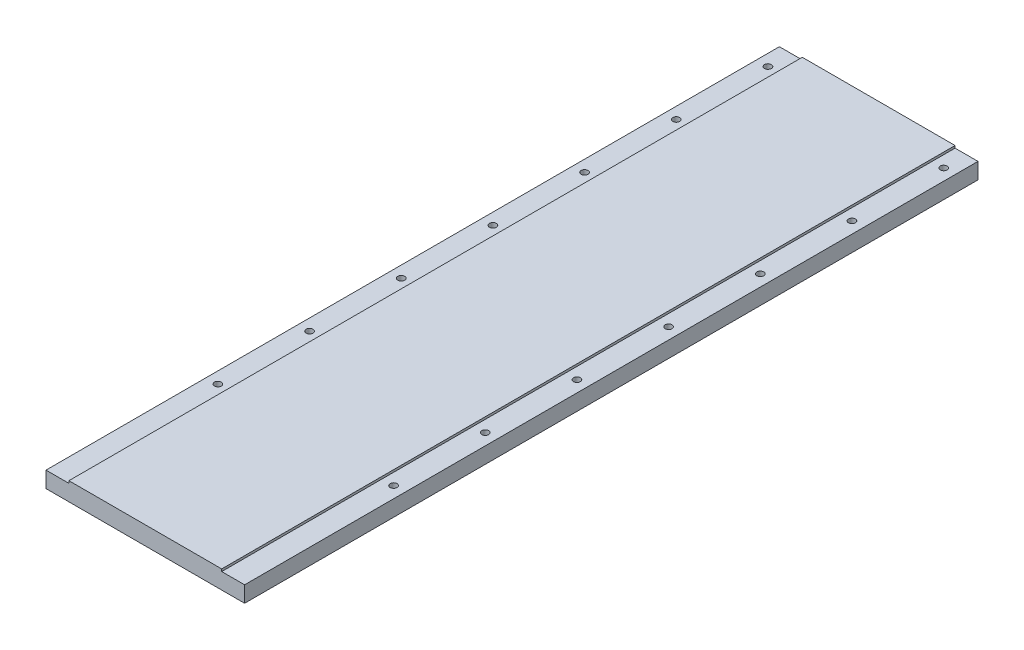
ISO-10303-21;
HEADER;
FILE_DESCRIPTION(('STEP AP214'),'2;1');
FILE_NAME('part.step','',(''),(''),'','','');
FILE_SCHEMA(('AUTOMOTIVE_DESIGN { 1 0 10303 214 1 1 1 1 }'));
ENDSEC;
DATA;
#1=APPLICATION_CONTEXT('core data for automotive mechanical design processes');
#2=APPLICATION_PROTOCOL_DEFINITION('international standard','automotive_design',2000,#1);
#3=PRODUCT_CONTEXT('',#1,'mechanical');
#4=PRODUCT('Part','Part','',(#3));
#5=PRODUCT_RELATED_PRODUCT_CATEGORY('part','',(#4));
#6=PRODUCT_DEFINITION_FORMATION('','',#4);
#7=PRODUCT_DEFINITION_CONTEXT('part definition',#1,'design');
#8=PRODUCT_DEFINITION('design','',#6,#7);
#9=PRODUCT_DEFINITION_SHAPE('','',#8);
#10=(LENGTH_UNIT() NAMED_UNIT(*) SI_UNIT(.MILLI.,.METRE.));
#11=(NAMED_UNIT(*) PLANE_ANGLE_UNIT() SI_UNIT($,.RADIAN.));
#12=(NAMED_UNIT(*) SI_UNIT($,.STERADIAN.) SOLID_ANGLE_UNIT());
#13=UNCERTAINTY_MEASURE_WITH_UNIT(LENGTH_MEASURE(1.E-05),#10,'distance_accuracy_value','');
#14=(GEOMETRIC_REPRESENTATION_CONTEXT(3) GLOBAL_UNCERTAINTY_ASSIGNED_CONTEXT((#13)) GLOBAL_UNIT_ASSIGNED_CONTEXT((#10,
#11,#12)) REPRESENTATION_CONTEXT('',''));
#15=CARTESIAN_POINT('',(0.,0.,0.));
#16=DIRECTION('',(0.,0.,1.));
#17=DIRECTION('',(1.,0.,0.));
#18=AXIS2_PLACEMENT_3D('',#15,#16,#17);
#19=CARTESIAN_POINT('',(-50.,10.5,480.));
#20=DIRECTION('',(0.,-1.,0.));
#21=DIRECTION('',(1.,0.,0.));
#22=AXIS2_PLACEMENT_3D('',#19,#20,#21);
#23=PLANE('',#22);
#24=CARTESIAN_POINT('',(-57.5,10.5,375.));
#25=DIRECTION('',(0.,1.,0.));
#26=DIRECTION('',(0.,0.,1.));
#27=AXIS2_PLACEMENT_3D('',#24,#25,#26);
#28=CIRCLE('',#27,2.24999999999999);
#29=CARTESIAN_POINT('',(-57.5,10.5,377.25));
#30=VERTEX_POINT('',#29);
#31=EDGE_CURVE('E221',#30,#30,#28,.T.);
#32=ORIENTED_EDGE('',*,*,#31,.F.);
#33=EDGE_LOOP('',(#32));
#34=FACE_BOUND('',#33,.T.);
#35=CARTESIAN_POINT('',(-57.5,10.5,315.));
#36=DIRECTION('',(0.,1.,0.));
#37=DIRECTION('',(0.,0.,1.));
#38=AXIS2_PLACEMENT_3D('',#35,#36,#37);
#39=CIRCLE('',#38,2.24999999999999);
#40=CARTESIAN_POINT('',(-57.5,10.5,317.25));
#41=VERTEX_POINT('',#40);
#42=EDGE_CURVE('E215',#41,#41,#39,.T.);
#43=ORIENTED_EDGE('',*,*,#42,.F.);
#44=EDGE_LOOP('',(#43));
#45=FACE_BOUND('',#44,.T.);
#46=CARTESIAN_POINT('',(-57.5,10.5,255.));
#47=DIRECTION('',(0.,1.,0.));
#48=DIRECTION('',(0.,0.,1.));
#49=AXIS2_PLACEMENT_3D('',#46,#47,#48);
#50=CIRCLE('',#49,2.24999999999999);
#51=CARTESIAN_POINT('',(-57.5,10.5,257.25));
#52=VERTEX_POINT('',#51);
#53=EDGE_CURVE('E209',#52,#52,#50,.T.);
#54=ORIENTED_EDGE('',*,*,#53,.F.);
#55=EDGE_LOOP('',(#54));
#56=FACE_BOUND('',#55,.T.);
#57=CARTESIAN_POINT('',(-57.5,10.5,195.));
#58=DIRECTION('',(0.,1.,0.));
#59=DIRECTION('',(0.,0.,1.));
#60=AXIS2_PLACEMENT_3D('',#57,#58,#59);
#61=CIRCLE('',#60,2.24999999999999);
#62=CARTESIAN_POINT('',(-57.5,10.5,197.25));
#63=VERTEX_POINT('',#62);
#64=EDGE_CURVE('E203',#63,#63,#61,.T.);
#65=ORIENTED_EDGE('',*,*,#64,.F.);
#66=EDGE_LOOP('',(#65));
#67=FACE_BOUND('',#66,.T.);
#68=CARTESIAN_POINT('',(-57.5,10.5,135.));
#69=DIRECTION('',(0.,1.,0.));
#70=DIRECTION('',(0.,0.,1.));
#71=AXIS2_PLACEMENT_3D('',#68,#69,#70);
#72=CIRCLE('',#71,2.24999999999999);
#73=CARTESIAN_POINT('',(-57.5,10.5,137.25));
#74=VERTEX_POINT('',#73);
#75=EDGE_CURVE('E197',#74,#74,#72,.T.);
#76=ORIENTED_EDGE('',*,*,#75,.F.);
#77=EDGE_LOOP('',(#76));
#78=FACE_BOUND('',#77,.T.);
#79=CARTESIAN_POINT('',(-57.5,10.5,75.));
#80=DIRECTION('',(0.,1.,0.));
#81=DIRECTION('',(0.,0.,1.));
#82=AXIS2_PLACEMENT_3D('',#79,#80,#81);
#83=CIRCLE('',#82,2.24999999999999);
#84=CARTESIAN_POINT('',(-57.5,10.5,77.25));
#85=VERTEX_POINT('',#84);
#86=EDGE_CURVE('E191',#85,#85,#83,.T.);
#87=ORIENTED_EDGE('',*,*,#86,.F.);
#88=EDGE_LOOP('',(#87));
#89=FACE_BOUND('',#88,.T.);
#90=CARTESIAN_POINT('',(-57.5,10.5,15.));
#91=DIRECTION('',(0.,1.,0.));
#92=DIRECTION('',(0.,0.,1.));
#93=AXIS2_PLACEMENT_3D('',#90,#91,#92);
#94=CIRCLE('',#93,2.24999999999999);
#95=CARTESIAN_POINT('',(-57.5,10.5,17.25));
#96=VERTEX_POINT('',#95);
#97=EDGE_CURVE('E185',#96,#96,#94,.T.);
#98=ORIENTED_EDGE('',*,*,#97,.F.);
#99=EDGE_LOOP('',(#98));
#100=FACE_BOUND('',#99,.T.);
#101=DIRECTION('',(-1.,0.,0.));
#102=VECTOR('',#101,1.);
#103=CARTESIAN_POINT('',(-50.,10.5,0.));
#104=LINE('',#103,#102);
#105=CARTESIAN_POINT('',(-50.,10.5,0.));
#106=VERTEX_POINT('',#105);
#107=CARTESIAN_POINT('',(-65.,10.5,0.));
#108=VERTEX_POINT('',#107);
#109=EDGE_CURVE('E135',#106,#108,#104,.T.);
#110=ORIENTED_EDGE('',*,*,#109,.T.);
#111=DIRECTION('',(0.,0.,-1.));
#112=VECTOR('',#111,1.);
#113=CARTESIAN_POINT('',(-65.,10.5,480.));
#114=LINE('',#113,#112);
#115=CARTESIAN_POINT('',(-65.,10.5,480.));
#116=VERTEX_POINT('',#115);
#117=EDGE_CURVE('E11',#116,#108,#114,.T.);
#118=ORIENTED_EDGE('',*,*,#117,.F.);
#119=DIRECTION('',(-1.,0.,0.));
#120=VECTOR('',#119,1.);
#121=CARTESIAN_POINT('',(-50.,10.5,480.));
#122=LINE('',#121,#120);
#123=CARTESIAN_POINT('',(-50.,10.5,480.));
#124=VERTEX_POINT('',#123);
#125=EDGE_CURVE('E150',#124,#116,#122,.T.);
#126=ORIENTED_EDGE('',*,*,#125,.F.);
#127=DIRECTION('',(0.,0.,-1.));
#128=VECTOR('',#127,1.);
#129=CARTESIAN_POINT('',(-50.,10.5,480.));
#130=LINE('',#129,#128);
#131=EDGE_CURVE('E131',#124,#106,#130,.T.);
#132=ORIENTED_EDGE('',*,*,#131,.T.);
#133=EDGE_LOOP('',(#110,#118,#126,#132));
#134=FACE_BOUND('',#133,.T.);
#135=ADVANCED_FACE('F39',(#34,#45,#56,#67,#78,#89,#100,#134),#23,.F.);
#136=CARTESIAN_POINT('',(-65.,10.5,480.));
#137=DIRECTION('',(1.,0.,0.));
#138=DIRECTION('',(0.,0.,-1.));
#139=AXIS2_PLACEMENT_3D('',#136,#137,#138);
#140=PLANE('',#139);
#141=DIRECTION('',(0.,-1.,0.));
#142=VECTOR('',#141,1.);
#143=CARTESIAN_POINT('',(-65.,10.5,0.));
#144=LINE('',#143,#142);
#145=CARTESIAN_POINT('',(-65.,0.,0.));
#146=VERTEX_POINT('',#145);
#147=EDGE_CURVE('E138',#108,#146,#144,.T.);
#148=ORIENTED_EDGE('',*,*,#147,.T.);
#149=DIRECTION('',(0.,0.,-1.));
#150=VECTOR('',#149,1.);
#151=CARTESIAN_POINT('',(-65.,0.,480.));
#152=LINE('',#151,#150);
#153=CARTESIAN_POINT('',(-65.,0.,480.));
#154=VERTEX_POINT('',#153);
#155=EDGE_CURVE('E47',#154,#146,#152,.T.);
#156=ORIENTED_EDGE('',*,*,#155,.F.);
#157=DIRECTION('',(0.,-1.,0.));
#158=VECTOR('',#157,1.);
#159=CARTESIAN_POINT('',(-65.,10.5,480.));
#160=LINE('',#159,#158);
#161=EDGE_CURVE('E98',#116,#154,#160,.T.);
#162=ORIENTED_EDGE('',*,*,#161,.F.);
#163=ORIENTED_EDGE('',*,*,#117,.T.);
#164=EDGE_LOOP('',(#148,#156,#162,#163));
#165=FACE_BOUND('',#164,.T.);
#166=ADVANCED_FACE('F302',(#165),#140,.F.);
#167=CARTESIAN_POINT('',(-65.,0.,480.));
#168=DIRECTION('',(0.,1.,0.));
#169=DIRECTION('',(0.,0.,1.));
#170=AXIS2_PLACEMENT_3D('',#167,#168,#169);
#171=PLANE('',#170);
#172=CARTESIAN_POINT('',(57.5,0.,375.));
#173=DIRECTION('',(0.,1.,0.));
#174=DIRECTION('',(0.,0.,1.));
#175=AXIS2_PLACEMENT_3D('',#172,#173,#174);
#176=CIRCLE('',#175,2.24999999999999);
#177=CARTESIAN_POINT('',(57.5,0.,377.25));
#178=VERTEX_POINT('',#177);
#179=EDGE_CURVE('E260',#178,#178,#176,.T.);
#180=ORIENTED_EDGE('',*,*,#179,.T.);
#181=EDGE_LOOP('',(#180));
#182=FACE_BOUND('',#181,.T.);
#183=CARTESIAN_POINT('',(57.5,0.,315.));
#184=DIRECTION('',(0.,1.,0.));
#185=DIRECTION('',(0.,0.,1.));
#186=AXIS2_PLACEMENT_3D('',#183,#184,#185);
#187=CIRCLE('',#186,2.24999999999999);
#188=CARTESIAN_POINT('',(57.5,0.,317.25));
#189=VERTEX_POINT('',#188);
#190=EDGE_CURVE('E254',#189,#189,#187,.T.);
#191=ORIENTED_EDGE('',*,*,#190,.T.);
#192=EDGE_LOOP('',(#191));
#193=FACE_BOUND('',#192,.T.);
#194=CARTESIAN_POINT('',(57.5,0.,255.));
#195=DIRECTION('',(0.,1.,0.));
#196=DIRECTION('',(0.,0.,1.));
#197=AXIS2_PLACEMENT_3D('',#194,#195,#196);
#198=CIRCLE('',#197,2.24999999999999);
#199=CARTESIAN_POINT('',(57.5,0.,257.25));
#200=VERTEX_POINT('',#199);
#201=EDGE_CURVE('E248',#200,#200,#198,.T.);
#202=ORIENTED_EDGE('',*,*,#201,.T.);
#203=EDGE_LOOP('',(#202));
#204=FACE_BOUND('',#203,.T.);
#205=CARTESIAN_POINT('',(57.5,0.,195.));
#206=DIRECTION('',(0.,1.,0.));
#207=DIRECTION('',(0.,0.,1.));
#208=AXIS2_PLACEMENT_3D('',#205,#206,#207);
#209=CIRCLE('',#208,2.24999999999999);
#210=CARTESIAN_POINT('',(57.5,0.,197.25));
#211=VERTEX_POINT('',#210);
#212=EDGE_CURVE('E242',#211,#211,#209,.T.);
#213=ORIENTED_EDGE('',*,*,#212,.T.);
#214=EDGE_LOOP('',(#213));
#215=FACE_BOUND('',#214,.T.);
#216=CARTESIAN_POINT('',(57.5,0.,135.));
#217=DIRECTION('',(0.,1.,0.));
#218=DIRECTION('',(0.,0.,1.));
#219=AXIS2_PLACEMENT_3D('',#216,#217,#218);
#220=CIRCLE('',#219,2.24999999999999);
#221=CARTESIAN_POINT('',(57.5,0.,137.25));
#222=VERTEX_POINT('',#221);
#223=EDGE_CURVE('E236',#222,#222,#220,.T.);
#224=ORIENTED_EDGE('',*,*,#223,.T.);
#225=EDGE_LOOP('',(#224));
#226=FACE_BOUND('',#225,.T.);
#227=CARTESIAN_POINT('',(57.5,0.,75.));
#228=DIRECTION('',(0.,1.,0.));
#229=DIRECTION('',(0.,0.,1.));
#230=AXIS2_PLACEMENT_3D('',#227,#228,#229);
#231=CIRCLE('',#230,2.24999999999999);
#232=CARTESIAN_POINT('',(57.5,0.,77.25));
#233=VERTEX_POINT('',#232);
#234=EDGE_CURVE('E230',#233,#233,#231,.T.);
#235=ORIENTED_EDGE('',*,*,#234,.T.);
#236=EDGE_LOOP('',(#235));
#237=FACE_BOUND('',#236,.T.);
#238=CARTESIAN_POINT('',(57.5,0.,15.));
#239=DIRECTION('',(0.,1.,0.));
#240=DIRECTION('',(0.,0.,1.));
#241=AXIS2_PLACEMENT_3D('',#238,#239,#240);
#242=CIRCLE('',#241,2.24999999999999);
#243=CARTESIAN_POINT('',(57.5,0.,17.25));
#244=VERTEX_POINT('',#243);
#245=EDGE_CURVE('E224',#244,#244,#242,.T.);
#246=ORIENTED_EDGE('',*,*,#245,.T.);
#247=EDGE_LOOP('',(#246));
#248=FACE_BOUND('',#247,.T.);
#249=CARTESIAN_POINT('',(-57.5,0.,375.));
#250=DIRECTION('',(0.,1.,0.));
#251=DIRECTION('',(0.,0.,1.));
#252=AXIS2_PLACEMENT_3D('',#249,#250,#251);
#253=CIRCLE('',#252,2.25);
#254=CARTESIAN_POINT('',(-57.5,0.,377.25));
#255=VERTEX_POINT('',#254);
#256=EDGE_CURVE('E218',#255,#255,#253,.T.);
#257=ORIENTED_EDGE('',*,*,#256,.T.);
#258=EDGE_LOOP('',(#257));
#259=FACE_BOUND('',#258,.T.);
#260=CARTESIAN_POINT('',(-57.5,0.,315.));
#261=DIRECTION('',(0.,1.,0.));
#262=DIRECTION('',(0.,0.,1.));
#263=AXIS2_PLACEMENT_3D('',#260,#261,#262);
#264=CIRCLE('',#263,2.25);
#265=CARTESIAN_POINT('',(-57.5,0.,317.25));
#266=VERTEX_POINT('',#265);
#267=EDGE_CURVE('E212',#266,#266,#264,.T.);
#268=ORIENTED_EDGE('',*,*,#267,.T.);
#269=EDGE_LOOP('',(#268));
#270=FACE_BOUND('',#269,.T.);
#271=CARTESIAN_POINT('',(-57.5,0.,255.));
#272=DIRECTION('',(0.,1.,0.));
#273=DIRECTION('',(0.,0.,1.));
#274=AXIS2_PLACEMENT_3D('',#271,#272,#273);
#275=CIRCLE('',#274,2.25);
#276=CARTESIAN_POINT('',(-57.5,0.,257.25));
#277=VERTEX_POINT('',#276);
#278=EDGE_CURVE('E206',#277,#277,#275,.T.);
#279=ORIENTED_EDGE('',*,*,#278,.T.);
#280=EDGE_LOOP('',(#279));
#281=FACE_BOUND('',#280,.T.);
#282=CARTESIAN_POINT('',(-57.5,0.,195.));
#283=DIRECTION('',(0.,1.,0.));
#284=DIRECTION('',(0.,0.,1.));
#285=AXIS2_PLACEMENT_3D('',#282,#283,#284);
#286=CIRCLE('',#285,2.25);
#287=CARTESIAN_POINT('',(-57.5,0.,197.25));
#288=VERTEX_POINT('',#287);
#289=EDGE_CURVE('E200',#288,#288,#286,.T.);
#290=ORIENTED_EDGE('',*,*,#289,.T.);
#291=EDGE_LOOP('',(#290));
#292=FACE_BOUND('',#291,.T.);
#293=CARTESIAN_POINT('',(-57.5,0.,135.));
#294=DIRECTION('',(0.,1.,0.));
#295=DIRECTION('',(0.,0.,1.));
#296=AXIS2_PLACEMENT_3D('',#293,#294,#295);
#297=CIRCLE('',#296,2.25);
#298=CARTESIAN_POINT('',(-57.5,0.,137.25));
#299=VERTEX_POINT('',#298);
#300=EDGE_CURVE('E194',#299,#299,#297,.T.);
#301=ORIENTED_EDGE('',*,*,#300,.T.);
#302=EDGE_LOOP('',(#301));
#303=FACE_BOUND('',#302,.T.);
#304=CARTESIAN_POINT('',(-57.5,0.,75.));
#305=DIRECTION('',(0.,1.,0.));
#306=DIRECTION('',(0.,0.,1.));
#307=AXIS2_PLACEMENT_3D('',#304,#305,#306);
#308=CIRCLE('',#307,2.25);
#309=CARTESIAN_POINT('',(-57.5,0.,77.25));
#310=VERTEX_POINT('',#309);
#311=EDGE_CURVE('E188',#310,#310,#308,.T.);
#312=ORIENTED_EDGE('',*,*,#311,.T.);
#313=EDGE_LOOP('',(#312));
#314=FACE_BOUND('',#313,.T.);
#315=CARTESIAN_POINT('',(-57.5,0.,15.));
#316=DIRECTION('',(0.,1.,0.));
#317=DIRECTION('',(0.,0.,1.));
#318=AXIS2_PLACEMENT_3D('',#315,#316,#317);
#319=CIRCLE('',#318,2.25);
#320=CARTESIAN_POINT('',(-57.5,0.,17.25));
#321=VERTEX_POINT('',#320);
#322=EDGE_CURVE('E139',#321,#321,#319,.T.);
#323=ORIENTED_EDGE('',*,*,#322,.T.);
#324=EDGE_LOOP('',(#323));
#325=FACE_BOUND('',#324,.T.);
#326=DIRECTION('',(1.,0.,0.));
#327=VECTOR('',#326,1.);
#328=CARTESIAN_POINT('',(-65.,0.,0.));
#329=LINE('',#328,#327);
#330=CARTESIAN_POINT('',(65.,0.,0.));
#331=VERTEX_POINT('',#330);
#332=EDGE_CURVE('E141',#146,#331,#329,.T.);
#333=ORIENTED_EDGE('',*,*,#332,.T.);
#334=DIRECTION('',(0.,0.,-1.));
#335=VECTOR('',#334,1.);
#336=CARTESIAN_POINT('',(65.,0.,480.));
#337=LINE('',#336,#335);
#338=CARTESIAN_POINT('',(65.,0.,480.));
#339=VERTEX_POINT('',#338);
#340=EDGE_CURVE('E157',#339,#331,#337,.T.);
#341=ORIENTED_EDGE('',*,*,#340,.F.);
#342=DIRECTION('',(1.,0.,0.));
#343=VECTOR('',#342,1.);
#344=CARTESIAN_POINT('',(-65.,0.,480.));
#345=LINE('',#344,#343);
#346=EDGE_CURVE('E165',#154,#339,#345,.T.);
#347=ORIENTED_EDGE('',*,*,#346,.F.);
#348=ORIENTED_EDGE('',*,*,#155,.T.);
#349=EDGE_LOOP('',(#333,#341,#347,#348));
#350=FACE_BOUND('',#349,.T.);
#351=ADVANCED_FACE('F163',(#182,#193,#204,#215,#226,#237,#248,#259,#270,#281,#292,#303,#314,
#325,#350),#171,.F.);
#352=CARTESIAN_POINT('',(65.,0.,480.));
#353=DIRECTION('',(-1.,0.,0.));
#354=DIRECTION('',(0.,0.,1.));
#355=AXIS2_PLACEMENT_3D('',#352,#353,#354);
#356=PLANE('',#355);
#357=DIRECTION('',(0.,1.,0.));
#358=VECTOR('',#357,1.);
#359=CARTESIAN_POINT('',(65.,0.,0.));
#360=LINE('',#359,#358);
#361=CARTESIAN_POINT('',(65.,10.5,0.));
#362=VERTEX_POINT('',#361);
#363=EDGE_CURVE('E143',#331,#362,#360,.T.);
#364=ORIENTED_EDGE('',*,*,#363,.T.);
#365=DIRECTION('',(0.,0.,-1.));
#366=VECTOR('',#365,1.);
#367=CARTESIAN_POINT('',(65.,10.5,480.));
#368=LINE('',#367,#366);
#369=CARTESIAN_POINT('',(65.,10.5,480.));
#370=VERTEX_POINT('',#369);
#371=EDGE_CURVE('E154',#370,#362,#368,.T.);
#372=ORIENTED_EDGE('',*,*,#371,.F.);
#373=DIRECTION('',(0.,1.,0.));
#374=VECTOR('',#373,1.);
#375=CARTESIAN_POINT('',(65.,0.,480.));
#376=LINE('',#375,#374);
#377=EDGE_CURVE('E177',#339,#370,#376,.T.);
#378=ORIENTED_EDGE('',*,*,#377,.F.);
#379=ORIENTED_EDGE('',*,*,#340,.T.);
#380=EDGE_LOOP('',(#364,#372,#378,#379));
#381=FACE_BOUND('',#380,.T.);
#382=ADVANCED_FACE('F173',(#381),#356,.F.);
#383=CARTESIAN_POINT('',(65.,10.5,480.));
#384=DIRECTION('',(0.,-1.,0.));
#385=DIRECTION('',(1.,0.,0.));
#386=AXIS2_PLACEMENT_3D('',#383,#384,#385);
#387=PLANE('',#386);
#388=CARTESIAN_POINT('',(57.5,10.5000000000001,375.));
#389=DIRECTION('',(0.,1.,0.));
#390=DIRECTION('',(0.,0.,1.));
#391=AXIS2_PLACEMENT_3D('',#388,#389,#390);
#392=CIRCLE('',#391,2.24999999999999);
#393=CARTESIAN_POINT('',(57.5,10.5000000000001,377.25));
#394=VERTEX_POINT('',#393);
#395=EDGE_CURVE('E263',#394,#394,#392,.T.);
#396=ORIENTED_EDGE('',*,*,#395,.F.);
#397=EDGE_LOOP('',(#396));
#398=FACE_BOUND('',#397,.T.);
#399=CARTESIAN_POINT('',(57.5,10.5000000000001,315.));
#400=DIRECTION('',(0.,1.,0.));
#401=DIRECTION('',(0.,0.,1.));
#402=AXIS2_PLACEMENT_3D('',#399,#400,#401);
#403=CIRCLE('',#402,2.24999999999999);
#404=CARTESIAN_POINT('',(57.5,10.5000000000001,317.25));
#405=VERTEX_POINT('',#404);
#406=EDGE_CURVE('E257',#405,#405,#403,.T.);
#407=ORIENTED_EDGE('',*,*,#406,.F.);
#408=EDGE_LOOP('',(#407));
#409=FACE_BOUND('',#408,.T.);
#410=CARTESIAN_POINT('',(57.5,10.5000000000001,255.));
#411=DIRECTION('',(0.,1.,0.));
#412=DIRECTION('',(0.,0.,1.));
#413=AXIS2_PLACEMENT_3D('',#410,#411,#412);
#414=CIRCLE('',#413,2.24999999999999);
#415=CARTESIAN_POINT('',(57.5,10.5000000000001,257.25));
#416=VERTEX_POINT('',#415);
#417=EDGE_CURVE('E251',#416,#416,#414,.T.);
#418=ORIENTED_EDGE('',*,*,#417,.F.);
#419=EDGE_LOOP('',(#418));
#420=FACE_BOUND('',#419,.T.);
#421=CARTESIAN_POINT('',(57.5,10.5000000000001,195.));
#422=DIRECTION('',(0.,1.,0.));
#423=DIRECTION('',(0.,0.,1.));
#424=AXIS2_PLACEMENT_3D('',#421,#422,#423);
#425=CIRCLE('',#424,2.24999999999999);
#426=CARTESIAN_POINT('',(57.5,10.5000000000001,197.25));
#427=VERTEX_POINT('',#426);
#428=EDGE_CURVE('E245',#427,#427,#425,.T.);
#429=ORIENTED_EDGE('',*,*,#428,.F.);
#430=EDGE_LOOP('',(#429));
#431=FACE_BOUND('',#430,.T.);
#432=CARTESIAN_POINT('',(57.5,10.5000000000001,135.));
#433=DIRECTION('',(0.,1.,0.));
#434=DIRECTION('',(0.,0.,1.));
#435=AXIS2_PLACEMENT_3D('',#432,#433,#434);
#436=CIRCLE('',#435,2.24999999999999);
#437=CARTESIAN_POINT('',(57.5,10.5000000000001,137.25));
#438=VERTEX_POINT('',#437);
#439=EDGE_CURVE('E239',#438,#438,#436,.T.);
#440=ORIENTED_EDGE('',*,*,#439,.F.);
#441=EDGE_LOOP('',(#440));
#442=FACE_BOUND('',#441,.T.);
#443=CARTESIAN_POINT('',(57.5,10.5000000000001,75.));
#444=DIRECTION('',(0.,1.,0.));
#445=DIRECTION('',(0.,0.,1.));
#446=AXIS2_PLACEMENT_3D('',#443,#444,#445);
#447=CIRCLE('',#446,2.24999999999999);
#448=CARTESIAN_POINT('',(57.5,10.5000000000001,77.25));
#449=VERTEX_POINT('',#448);
#450=EDGE_CURVE('E233',#449,#449,#447,.T.);
#451=ORIENTED_EDGE('',*,*,#450,.F.);
#452=EDGE_LOOP('',(#451));
#453=FACE_BOUND('',#452,.T.);
#454=CARTESIAN_POINT('',(57.5,10.5000000000001,15.));
#455=DIRECTION('',(0.,1.,0.));
#456=DIRECTION('',(0.,0.,1.));
#457=AXIS2_PLACEMENT_3D('',#454,#455,#456);
#458=CIRCLE('',#457,2.24999999999999);
#459=CARTESIAN_POINT('',(57.5,10.5000000000001,17.25));
#460=VERTEX_POINT('',#459);
#461=EDGE_CURVE('E227',#460,#460,#458,.T.);
#462=ORIENTED_EDGE('',*,*,#461,.F.);
#463=EDGE_LOOP('',(#462));
#464=FACE_BOUND('',#463,.T.);
#465=DIRECTION('',(-1.,0.,0.));
#466=VECTOR('',#465,1.);
#467=CARTESIAN_POINT('',(65.,10.5,0.));
#468=LINE('',#467,#466);
#469=CARTESIAN_POINT('',(50.,10.5,0.));
#470=VERTEX_POINT('',#469);
#471=EDGE_CURVE('E145',#362,#470,#468,.T.);
#472=ORIENTED_EDGE('',*,*,#471,.T.);
#473=DIRECTION('',(0.,0.,-1.));
#474=VECTOR('',#473,1.);
#475=CARTESIAN_POINT('',(50.,10.5,480.));
#476=LINE('',#475,#474);
#477=CARTESIAN_POINT('',(50.,10.5,480.));
#478=VERTEX_POINT('',#477);
#479=EDGE_CURVE('E126',#478,#470,#476,.T.);
#480=ORIENTED_EDGE('',*,*,#479,.F.);
#481=DIRECTION('',(-1.,0.,0.));
#482=VECTOR('',#481,1.);
#483=CARTESIAN_POINT('',(65.,10.5,480.));
#484=LINE('',#483,#482);
#485=EDGE_CURVE('E117',#370,#478,#484,.T.);
#486=ORIENTED_EDGE('',*,*,#485,.F.);
#487=ORIENTED_EDGE('',*,*,#371,.T.);
#488=EDGE_LOOP('',(#472,#480,#486,#487));
#489=FACE_BOUND('',#488,.T.);
#490=ADVANCED_FACE('F176',(#398,#409,#420,#431,#442,#453,#464,#489),#387,.F.);
#491=CARTESIAN_POINT('',(50.,10.5,480.));
#492=DIRECTION('',(-1.,0.,0.));
#493=DIRECTION('',(0.,0.,1.));
#494=AXIS2_PLACEMENT_3D('',#491,#492,#493);
#495=PLANE('',#494);
#496=DIRECTION('',(0.,1.,0.));
#497=VECTOR('',#496,1.);
#498=CARTESIAN_POINT('',(50.,10.5,0.));
#499=LINE('',#498,#497);
#500=CARTESIAN_POINT('',(50.,12.,0.));
#501=VERTEX_POINT('',#500);
#502=EDGE_CURVE('E125',#470,#501,#499,.T.);
#503=ORIENTED_EDGE('',*,*,#502,.T.);
#504=DIRECTION('',(0.,0.,-1.));
#505=VECTOR('',#504,1.);
#506=CARTESIAN_POINT('',(50.,12.,480.));
#507=LINE('',#506,#505);
#508=CARTESIAN_POINT('',(50.,12.,480.));
#509=VERTEX_POINT('',#508);
#510=EDGE_CURVE('E122',#509,#501,#507,.T.);
#511=ORIENTED_EDGE('',*,*,#510,.F.);
#512=DIRECTION('',(0.,1.,0.));
#513=VECTOR('',#512,1.);
#514=CARTESIAN_POINT('',(50.,10.5,480.));
#515=LINE('',#514,#513);
#516=EDGE_CURVE('E111',#478,#509,#515,.T.);
#517=ORIENTED_EDGE('',*,*,#516,.F.);
#518=ORIENTED_EDGE('',*,*,#479,.T.);
#519=EDGE_LOOP('',(#503,#511,#517,#518));
#520=FACE_BOUND('',#519,.T.);
#521=ADVANCED_FACE('F123',(#520),#495,.F.);
#522=CARTESIAN_POINT('',(50.,12.,480.));
#523=DIRECTION('',(0.,-1.,0.));
#524=DIRECTION('',(0.,0.,-1.));
#525=AXIS2_PLACEMENT_3D('',#522,#523,#524);
#526=PLANE('',#525);
#527=DIRECTION('',(-1.,0.,0.));
#528=VECTOR('',#527,1.);
#529=CARTESIAN_POINT('',(50.,12.,0.));
#530=LINE('',#529,#528);
#531=CARTESIAN_POINT('',(-50.,12.,0.));
#532=VERTEX_POINT('',#531);
#533=EDGE_CURVE('E84',#501,#532,#530,.T.);
#534=ORIENTED_EDGE('',*,*,#533,.T.);
#535=DIRECTION('',(0.,0.,-1.));
#536=VECTOR('',#535,1.);
#537=CARTESIAN_POINT('',(-50.,12.,480.));
#538=LINE('',#537,#536);
#539=CARTESIAN_POINT('',(-50.,12.,480.));
#540=VERTEX_POINT('',#539);
#541=EDGE_CURVE('E127',#540,#532,#538,.T.);
#542=ORIENTED_EDGE('',*,*,#541,.F.);
#543=DIRECTION('',(-1.,0.,0.));
#544=VECTOR('',#543,1.);
#545=CARTESIAN_POINT('',(50.,12.,480.));
#546=LINE('',#545,#544);
#547=EDGE_CURVE('E115',#509,#540,#546,.T.);
#548=ORIENTED_EDGE('',*,*,#547,.F.);
#549=ORIENTED_EDGE('',*,*,#510,.T.);
#550=EDGE_LOOP('',(#534,#542,#548,#549));
#551=FACE_BOUND('',#550,.T.);
#552=ADVANCED_FACE('F129',(#551),#526,.F.);
#553=CARTESIAN_POINT('',(-50.,12.,480.));
#554=DIRECTION('',(1.,0.,0.));
#555=DIRECTION('',(0.,0.,-1.));
#556=AXIS2_PLACEMENT_3D('',#553,#554,#555);
#557=PLANE('',#556);
#558=DIRECTION('',(0.,-1.,0.));
#559=VECTOR('',#558,1.);
#560=CARTESIAN_POINT('',(-50.,12.,0.));
#561=LINE('',#560,#559);
#562=EDGE_CURVE('E90',#532,#106,#561,.T.);
#563=ORIENTED_EDGE('',*,*,#562,.T.);
#564=ORIENTED_EDGE('',*,*,#131,.F.);
#565=DIRECTION('',(0.,-1.,0.));
#566=VECTOR('',#565,1.);
#567=CARTESIAN_POINT('',(-50.,12.,480.));
#568=LINE('',#567,#566);
#569=EDGE_CURVE('E55',#540,#124,#568,.T.);
#570=ORIENTED_EDGE('',*,*,#569,.F.);
#571=ORIENTED_EDGE('',*,*,#541,.T.);
#572=EDGE_LOOP('',(#563,#564,#570,#571));
#573=FACE_BOUND('',#572,.T.);
#574=ADVANCED_FACE('F325',(#573),#557,.F.);
#575=CARTESIAN_POINT('',(0.,0.,480.));
#576=DIRECTION('',(0.,0.,1.));
#577=DIRECTION('',(1.,0.,0.));
#578=AXIS2_PLACEMENT_3D('',#575,#576,#577);
#579=PLANE('',#578);
#580=ORIENTED_EDGE('',*,*,#125,.T.);
#581=ORIENTED_EDGE('',*,*,#161,.T.);
#582=ORIENTED_EDGE('',*,*,#346,.T.);
#583=ORIENTED_EDGE('',*,*,#377,.T.);
#584=ORIENTED_EDGE('',*,*,#485,.T.);
#585=ORIENTED_EDGE('',*,*,#516,.T.);
#586=ORIENTED_EDGE('',*,*,#547,.T.);
#587=ORIENTED_EDGE('',*,*,#569,.T.);
#588=EDGE_LOOP('',(#580,#581,#582,#583,#584,#585,#586,#587));
#589=FACE_BOUND('',#588,.T.);
#590=ADVANCED_FACE('F113',(#589),#579,.T.);
#591=CARTESIAN_POINT('',(0.,0.,0.));
#592=DIRECTION('',(0.,0.,1.));
#593=DIRECTION('',(1.,0.,0.));
#594=AXIS2_PLACEMENT_3D('',#591,#592,#593);
#595=PLANE('',#594);
#596=ORIENTED_EDGE('',*,*,#109,.F.);
#597=ORIENTED_EDGE('',*,*,#562,.F.);
#598=ORIENTED_EDGE('',*,*,#533,.F.);
#599=ORIENTED_EDGE('',*,*,#502,.F.);
#600=ORIENTED_EDGE('',*,*,#471,.F.);
#601=ORIENTED_EDGE('',*,*,#363,.F.);
#602=ORIENTED_EDGE('',*,*,#332,.F.);
#603=ORIENTED_EDGE('',*,*,#147,.F.);
#604=EDGE_LOOP('',(#596,#597,#598,#599,#600,#601,#602,#603));
#605=FACE_BOUND('',#604,.T.);
#606=ADVANCED_FACE('F169',(#605),#595,.F.);
#607=CARTESIAN_POINT('',(-57.5,10.5,15.));
#608=DIRECTION('',(0.,1.,0.));
#609=DIRECTION('',(0.,0.,1.));
#610=AXIS2_PLACEMENT_3D('',#607,#608,#609);
#611=CYLINDRICAL_SURFACE('',#610,2.24999999999999);
#612=ORIENTED_EDGE('',*,*,#322,.F.);
#613=EDGE_LOOP('',(#612));
#614=FACE_BOUND('',#613,.T.);
#615=ORIENTED_EDGE('',*,*,#97,.T.);
#616=EDGE_LOOP('',(#615));
#617=FACE_BOUND('',#616,.T.);
#618=ADVANCED_FACE('F372',(#614,#617),#611,.F.);
#619=CARTESIAN_POINT('',(-57.5,10.5,75.));
#620=DIRECTION('',(0.,1.,0.));
#621=DIRECTION('',(0.,0.,1.));
#622=AXIS2_PLACEMENT_3D('',#619,#620,#621);
#623=CYLINDRICAL_SURFACE('',#622,2.24999999999999);
#624=ORIENTED_EDGE('',*,*,#311,.F.);
#625=EDGE_LOOP('',(#624));
#626=FACE_BOUND('',#625,.T.);
#627=ORIENTED_EDGE('',*,*,#86,.T.);
#628=EDGE_LOOP('',(#627));
#629=FACE_BOUND('',#628,.T.);
#630=ADVANCED_FACE('F375',(#626,#629),#623,.F.);
#631=CARTESIAN_POINT('',(-57.5,10.5,135.));
#632=DIRECTION('',(0.,1.,0.));
#633=DIRECTION('',(0.,0.,1.));
#634=AXIS2_PLACEMENT_3D('',#631,#632,#633);
#635=CYLINDRICAL_SURFACE('',#634,2.24999999999999);
#636=ORIENTED_EDGE('',*,*,#300,.F.);
#637=EDGE_LOOP('',(#636));
#638=FACE_BOUND('',#637,.T.);
#639=ORIENTED_EDGE('',*,*,#75,.T.);
#640=EDGE_LOOP('',(#639));
#641=FACE_BOUND('',#640,.T.);
#642=ADVANCED_FACE('F380',(#638,#641),#635,.F.);
#643=CARTESIAN_POINT('',(-57.5,10.5,195.));
#644=DIRECTION('',(0.,1.,0.));
#645=DIRECTION('',(0.,0.,1.));
#646=AXIS2_PLACEMENT_3D('',#643,#644,#645);
#647=CYLINDRICAL_SURFACE('',#646,2.24999999999999);
#648=ORIENTED_EDGE('',*,*,#289,.F.);
#649=EDGE_LOOP('',(#648));
#650=FACE_BOUND('',#649,.T.);
#651=ORIENTED_EDGE('',*,*,#64,.T.);
#652=EDGE_LOOP('',(#651));
#653=FACE_BOUND('',#652,.T.);
#654=ADVANCED_FACE('F386',(#650,#653),#647,.F.);
#655=CARTESIAN_POINT('',(-57.5,10.5,255.));
#656=DIRECTION('',(0.,1.,0.));
#657=DIRECTION('',(0.,0.,1.));
#658=AXIS2_PLACEMENT_3D('',#655,#656,#657);
#659=CYLINDRICAL_SURFACE('',#658,2.24999999999999);
#660=ORIENTED_EDGE('',*,*,#278,.F.);
#661=EDGE_LOOP('',(#660));
#662=FACE_BOUND('',#661,.T.);
#663=ORIENTED_EDGE('',*,*,#53,.T.);
#664=EDGE_LOOP('',(#663));
#665=FACE_BOUND('',#664,.T.);
#666=ADVANCED_FACE('F390',(#662,#665),#659,.F.);
#667=CARTESIAN_POINT('',(-57.5,10.5,315.));
#668=DIRECTION('',(0.,1.,0.));
#669=DIRECTION('',(0.,0.,1.));
#670=AXIS2_PLACEMENT_3D('',#667,#668,#669);
#671=CYLINDRICAL_SURFACE('',#670,2.24999999999999);
#672=ORIENTED_EDGE('',*,*,#267,.F.);
#673=EDGE_LOOP('',(#672));
#674=FACE_BOUND('',#673,.T.);
#675=ORIENTED_EDGE('',*,*,#42,.T.);
#676=EDGE_LOOP('',(#675));
#677=FACE_BOUND('',#676,.T.);
#678=ADVANCED_FACE('F297',(#674,#677),#671,.F.);
#679=CARTESIAN_POINT('',(-57.5,10.5,375.));
#680=DIRECTION('',(0.,1.,0.));
#681=DIRECTION('',(0.,0.,1.));
#682=AXIS2_PLACEMENT_3D('',#679,#680,#681);
#683=CYLINDRICAL_SURFACE('',#682,2.24999999999999);
#684=ORIENTED_EDGE('',*,*,#256,.F.);
#685=EDGE_LOOP('',(#684));
#686=FACE_BOUND('',#685,.T.);
#687=ORIENTED_EDGE('',*,*,#31,.T.);
#688=EDGE_LOOP('',(#687));
#689=FACE_BOUND('',#688,.T.);
#690=ADVANCED_FACE('F287',(#686,#689),#683,.F.);
#691=CARTESIAN_POINT('',(57.5,10.5000000000001,15.));
#692=DIRECTION('',(0.,1.,0.));
#693=DIRECTION('',(0.,0.,1.));
#694=AXIS2_PLACEMENT_3D('',#691,#692,#693);
#695=CYLINDRICAL_SURFACE('',#694,2.24999999999999);
#696=ORIENTED_EDGE('',*,*,#245,.F.);
#697=EDGE_LOOP('',(#696));
#698=FACE_BOUND('',#697,.T.);
#699=ORIENTED_EDGE('',*,*,#461,.T.);
#700=EDGE_LOOP('',(#699));
#701=FACE_BOUND('',#700,.T.);
#702=ADVANCED_FACE('F284',(#698,#701),#695,.F.);
#703=CARTESIAN_POINT('',(57.5,10.5000000000001,75.));
#704=DIRECTION('',(0.,1.,0.));
#705=DIRECTION('',(0.,0.,1.));
#706=AXIS2_PLACEMENT_3D('',#703,#704,#705);
#707=CYLINDRICAL_SURFACE('',#706,2.24999999999999);
#708=ORIENTED_EDGE('',*,*,#234,.F.);
#709=EDGE_LOOP('',(#708));
#710=FACE_BOUND('',#709,.T.);
#711=ORIENTED_EDGE('',*,*,#450,.T.);
#712=EDGE_LOOP('',(#711));
#713=FACE_BOUND('',#712,.T.);
#714=ADVANCED_FACE('F286',(#710,#713),#707,.F.);
#715=CARTESIAN_POINT('',(57.5,10.5000000000001,135.));
#716=DIRECTION('',(0.,1.,0.));
#717=DIRECTION('',(0.,0.,1.));
#718=AXIS2_PLACEMENT_3D('',#715,#716,#717);
#719=CYLINDRICAL_SURFACE('',#718,2.24999999999999);
#720=ORIENTED_EDGE('',*,*,#223,.F.);
#721=EDGE_LOOP('',(#720));
#722=FACE_BOUND('',#721,.T.);
#723=ORIENTED_EDGE('',*,*,#439,.T.);
#724=EDGE_LOOP('',(#723));
#725=FACE_BOUND('',#724,.T.);
#726=ADVANCED_FACE('F294',(#722,#725),#719,.F.);
#727=CARTESIAN_POINT('',(57.5,10.5000000000001,195.));
#728=DIRECTION('',(0.,1.,0.));
#729=DIRECTION('',(0.,0.,1.));
#730=AXIS2_PLACEMENT_3D('',#727,#728,#729);
#731=CYLINDRICAL_SURFACE('',#730,2.24999999999999);
#732=ORIENTED_EDGE('',*,*,#212,.F.);
#733=EDGE_LOOP('',(#732));
#734=FACE_BOUND('',#733,.T.);
#735=ORIENTED_EDGE('',*,*,#428,.T.);
#736=EDGE_LOOP('',(#735));
#737=FACE_BOUND('',#736,.T.);
#738=ADVANCED_FACE('F435',(#734,#737),#731,.F.);
#739=CARTESIAN_POINT('',(57.5,10.5000000000001,255.));
#740=DIRECTION('',(0.,1.,0.));
#741=DIRECTION('',(0.,0.,1.));
#742=AXIS2_PLACEMENT_3D('',#739,#740,#741);
#743=CYLINDRICAL_SURFACE('',#742,2.24999999999999);
#744=ORIENTED_EDGE('',*,*,#201,.F.);
#745=EDGE_LOOP('',(#744));
#746=FACE_BOUND('',#745,.T.);
#747=ORIENTED_EDGE('',*,*,#417,.T.);
#748=EDGE_LOOP('',(#747));
#749=FACE_BOUND('',#748,.T.);
#750=ADVANCED_FACE('F446',(#746,#749),#743,.F.);
#751=CARTESIAN_POINT('',(57.5,10.5000000000001,315.));
#752=DIRECTION('',(0.,1.,0.));
#753=DIRECTION('',(0.,0.,1.));
#754=AXIS2_PLACEMENT_3D('',#751,#752,#753);
#755=CYLINDRICAL_SURFACE('',#754,2.24999999999999);
#756=ORIENTED_EDGE('',*,*,#190,.F.);
#757=EDGE_LOOP('',(#756));
#758=FACE_BOUND('',#757,.T.);
#759=ORIENTED_EDGE('',*,*,#406,.T.);
#760=EDGE_LOOP('',(#759));
#761=FACE_BOUND('',#760,.T.);
#762=ADVANCED_FACE('F457',(#758,#761),#755,.F.);
#763=CARTESIAN_POINT('',(57.5,10.5000000000001,375.));
#764=DIRECTION('',(0.,1.,0.));
#765=DIRECTION('',(0.,0.,1.));
#766=AXIS2_PLACEMENT_3D('',#763,#764,#765);
#767=CYLINDRICAL_SURFACE('',#766,2.24999999999999);
#768=ORIENTED_EDGE('',*,*,#179,.F.);
#769=EDGE_LOOP('',(#768));
#770=FACE_BOUND('',#769,.T.);
#771=ORIENTED_EDGE('',*,*,#395,.T.);
#772=EDGE_LOOP('',(#771));
#773=FACE_BOUND('',#772,.T.);
#774=ADVANCED_FACE('F267',(#770,#773),#767,.F.);
#775=CLOSED_SHELL('',(#135,#166,#351,#382,#490,#521,#552,#574,#590,#606,#618,#630,#642,#654,
#666,#678,#690,#702,#714,#726,#738,#750,#762,#774));
#776=MANIFOLD_SOLID_BREP('B2',#775);
#777=ADVANCED_BREP_SHAPE_REPRESENTATION('',(#18,#776),#14);
#778=SHAPE_DEFINITION_REPRESENTATION(#9,#777);
ENDSEC;
END-ISO-10303-21;
